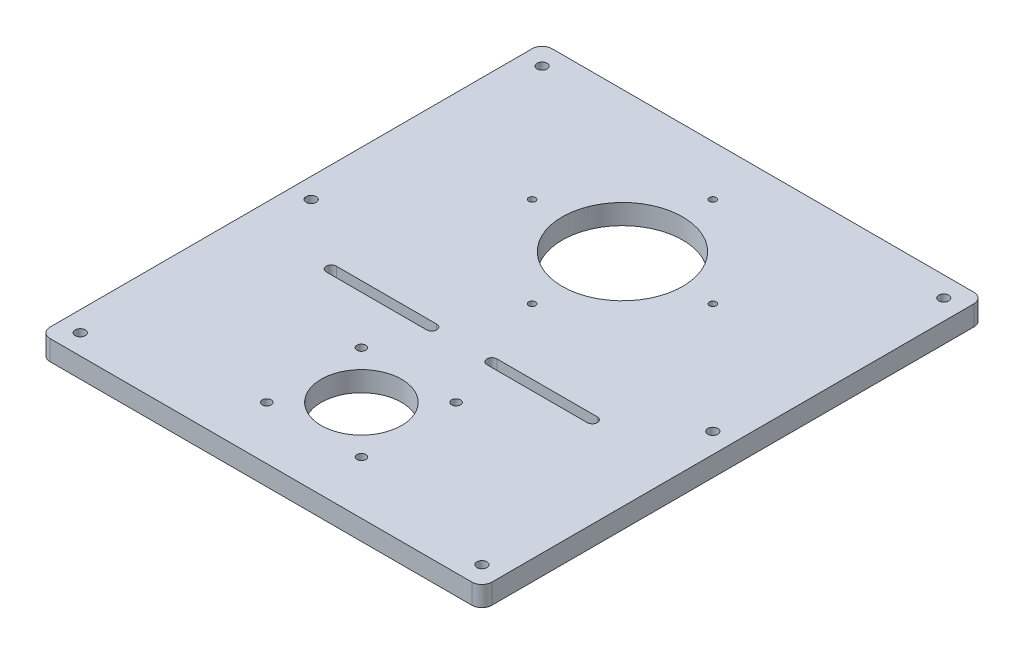
ISO-10303-21;
HEADER;
FILE_DESCRIPTION(('STEP AP214'),'2;1');
FILE_NAME('part.step','',(''),(''),'','','');
FILE_SCHEMA(('AUTOMOTIVE_DESIGN { 1 0 10303 214 1 1 1 1 }'));
ENDSEC;
DATA;
#1=APPLICATION_CONTEXT('core data for automotive mechanical design processes');
#2=APPLICATION_PROTOCOL_DEFINITION('international standard','automotive_design',2000,#1);
#3=PRODUCT_CONTEXT('',#1,'mechanical');
#4=PRODUCT('Part','Part','',(#3));
#5=PRODUCT_RELATED_PRODUCT_CATEGORY('part','',(#4));
#6=PRODUCT_DEFINITION_FORMATION('','',#4);
#7=PRODUCT_DEFINITION_CONTEXT('part definition',#1,'design');
#8=PRODUCT_DEFINITION('design','',#6,#7);
#9=PRODUCT_DEFINITION_SHAPE('','',#8);
#10=(LENGTH_UNIT() NAMED_UNIT(*) SI_UNIT(.MILLI.,.METRE.));
#11=(NAMED_UNIT(*) PLANE_ANGLE_UNIT() SI_UNIT($,.RADIAN.));
#12=(NAMED_UNIT(*) SI_UNIT($,.STERADIAN.) SOLID_ANGLE_UNIT());
#13=UNCERTAINTY_MEASURE_WITH_UNIT(LENGTH_MEASURE(1.E-05),#10,'distance_accuracy_value','');
#14=(GEOMETRIC_REPRESENTATION_CONTEXT(3) GLOBAL_UNCERTAINTY_ASSIGNED_CONTEXT((#13)) GLOBAL_UNIT_ASSIGNED_CONTEXT((#10,
#11,#12)) REPRESENTATION_CONTEXT('',''));
#15=CARTESIAN_POINT('',(0.,0.,0.));
#16=DIRECTION('',(0.,0.,1.));
#17=DIRECTION('',(1.,0.,0.));
#18=AXIS2_PLACEMENT_3D('',#15,#16,#17);
#19=CARTESIAN_POINT('',(0.,10.,0.));
#20=DIRECTION('',(0.,1.,0.));
#21=DIRECTION('',(0.,0.,1.));
#22=AXIS2_PLACEMENT_3D('',#19,#20,#21);
#23=PLANE('',#22);
#24=CARTESIAN_POINT('',(45.,10.,-1.57116660247941E-13));
#25=DIRECTION('',(0.,1.,0.));
#26=DIRECTION('',(0.,0.,1.));
#27=AXIS2_PLACEMENT_3D('',#24,#25,#26);
#28=CIRCLE('',#27,1.7);
#29=CARTESIAN_POINT('',(45.,10.,1.69999999999984));
#30=VERTEX_POINT('',#29);
#31=EDGE_CURVE('E781',#30,#30,#28,.T.);
#32=ORIENTED_EDGE('',*,*,#31,.F.);
#33=EDGE_LOOP('',(#32));
#34=FACE_BOUND('',#33,.T.);
#35=CARTESIAN_POINT('',(0.,10.,-45.));
#36=DIRECTION('',(0.,1.,0.));
#37=DIRECTION('',(0.,0.,1.));
#38=AXIS2_PLACEMENT_3D('',#35,#36,#37);
#39=CIRCLE('',#38,1.7);
#40=CARTESIAN_POINT('',(0.,10.,-43.3));
#41=VERTEX_POINT('',#40);
#42=EDGE_CURVE('E783',#41,#41,#39,.T.);
#43=ORIENTED_EDGE('',*,*,#42,.F.);
#44=EDGE_LOOP('',(#43));
#45=FACE_BOUND('',#44,.T.);
#46=CARTESIAN_POINT('',(-45.,10.,4.71349980743823E-13));
#47=DIRECTION('',(0.,1.,0.));
#48=DIRECTION('',(0.,0.,1.));
#49=AXIS2_PLACEMENT_3D('',#46,#47,#48);
#50=CIRCLE('',#49,1.7);
#51=CARTESIAN_POINT('',(-45.,10.,1.70000000000047));
#52=VERTEX_POINT('',#51);
#53=EDGE_CURVE('E786',#52,#52,#50,.T.);
#54=ORIENTED_EDGE('',*,*,#53,.F.);
#55=EDGE_LOOP('',(#54));
#56=FACE_BOUND('',#55,.T.);
#57=CARTESIAN_POINT('',(0.,10.,45.));
#58=DIRECTION('',(0.,1.,0.));
#59=DIRECTION('',(0.,0.,1.));
#60=AXIS2_PLACEMENT_3D('',#57,#58,#59);
#61=CIRCLE('',#60,1.7);
#62=CARTESIAN_POINT('',(0.,10.,46.7));
#63=VERTEX_POINT('',#62);
#64=EDGE_CURVE('E758',#63,#63,#61,.T.);
#65=ORIENTED_EDGE('',*,*,#64,.F.);
#66=EDGE_LOOP('',(#65));
#67=FACE_BOUND('',#66,.T.);
#68=CARTESIAN_POINT('',(-100.,10.,55.));
#69=DIRECTION('',(0.,1.,0.));
#70=DIRECTION('',(0.,0.,1.));
#71=AXIS2_PLACEMENT_3D('',#68,#69,#70);
#72=CIRCLE('',#71,2.50000000000001);
#73=CARTESIAN_POINT('',(-100.,10.,57.5));
#74=VERTEX_POINT('',#73);
#75=EDGE_CURVE('E188',#74,#74,#72,.T.);
#76=ORIENTED_EDGE('',*,*,#75,.F.);
#77=EDGE_LOOP('',(#76));
#78=FACE_BOUND('',#77,.T.);
#79=CARTESIAN_POINT('',(100.,10.,170.));
#80=DIRECTION('',(0.,1.,0.));
#81=DIRECTION('',(0.,0.,1.));
#82=AXIS2_PLACEMENT_3D('',#79,#80,#81);
#83=CIRCLE('',#82,2.50000000000001);
#84=CARTESIAN_POINT('',(100.,10.,172.5));
#85=VERTEX_POINT('',#84);
#86=EDGE_CURVE('E737',#85,#85,#83,.T.);
#87=ORIENTED_EDGE('',*,*,#86,.F.);
#88=EDGE_LOOP('',(#87));
#89=FACE_BOUND('',#88,.T.);
#90=CARTESIAN_POINT('',(-100.,10.,170.));
#91=DIRECTION('',(0.,1.,0.));
#92=DIRECTION('',(0.,0.,1.));
#93=AXIS2_PLACEMENT_3D('',#90,#91,#92);
#94=CIRCLE('',#93,2.50000000000001);
#95=CARTESIAN_POINT('',(-100.,10.,172.5));
#96=VERTEX_POINT('',#95);
#97=EDGE_CURVE('E734',#96,#96,#94,.T.);
#98=ORIENTED_EDGE('',*,*,#97,.F.);
#99=EDGE_LOOP('',(#98));
#100=FACE_BOUND('',#99,.T.);
#101=CARTESIAN_POINT('',(100.,10.,-60.));
#102=DIRECTION('',(0.,1.,0.));
#103=DIRECTION('',(0.,0.,1.));
#104=AXIS2_PLACEMENT_3D('',#101,#102,#103);
#105=CIRCLE('',#104,2.50000000000001);
#106=CARTESIAN_POINT('',(100.,10.,-57.5));
#107=VERTEX_POINT('',#106);
#108=EDGE_CURVE('E731',#107,#107,#105,.T.);
#109=ORIENTED_EDGE('',*,*,#108,.F.);
#110=EDGE_LOOP('',(#109));
#111=FACE_BOUND('',#110,.T.);
#112=CARTESIAN_POINT('',(100.,10.,55.));
#113=DIRECTION('',(0.,1.,0.));
#114=DIRECTION('',(0.,0.,1.));
#115=AXIS2_PLACEMENT_3D('',#112,#113,#114);
#116=CIRCLE('',#115,2.5);
#117=CARTESIAN_POINT('',(100.,10.,57.5));
#118=VERTEX_POINT('',#117);
#119=EDGE_CURVE('E722',#118,#118,#116,.T.);
#120=ORIENTED_EDGE('',*,*,#119,.F.);
#121=EDGE_LOOP('',(#120));
#122=FACE_BOUND('',#121,.T.);
#123=CARTESIAN_POINT('',(-100.,10.,-60.));
#124=DIRECTION('',(0.,1.,0.));
#125=DIRECTION('',(0.,0.,1.));
#126=AXIS2_PLACEMENT_3D('',#123,#124,#125);
#127=CIRCLE('',#126,2.50000000000001);
#128=CARTESIAN_POINT('',(-100.,10.,-57.5));
#129=VERTEX_POINT('',#128);
#130=EDGE_CURVE('E715',#129,#129,#127,.T.);
#131=ORIENTED_EDGE('',*,*,#130,.F.);
#132=EDGE_LOOP('',(#131));
#133=FACE_BOUND('',#132,.T.);
#134=CARTESIAN_POINT('',(-23.57,10.,153.57));
#135=DIRECTION('',(0.,1.,0.));
#136=DIRECTION('',(0.,0.,1.));
#137=AXIS2_PLACEMENT_3D('',#134,#135,#136);
#138=CIRCLE('',#137,2.2);
#139=CARTESIAN_POINT('',(-23.57,10.,155.77));
#140=VERTEX_POINT('',#139);
#141=EDGE_CURVE('E236',#140,#140,#138,.T.);
#142=ORIENTED_EDGE('',*,*,#141,.F.);
#143=EDGE_LOOP('',(#142));
#144=FACE_BOUND('',#143,.T.);
#145=CARTESIAN_POINT('',(-23.57,10.,106.43));
#146=DIRECTION('',(0.,1.,0.));
#147=DIRECTION('',(0.,0.,1.));
#148=AXIS2_PLACEMENT_3D('',#145,#146,#147);
#149=CIRCLE('',#148,2.2);
#150=CARTESIAN_POINT('',(-23.57,10.,108.63));
#151=VERTEX_POINT('',#150);
#152=EDGE_CURVE('E248',#151,#151,#149,.T.);
#153=ORIENTED_EDGE('',*,*,#152,.F.);
#154=EDGE_LOOP('',(#153));
#155=FACE_BOUND('',#154,.T.);
#156=CARTESIAN_POINT('',(0.,10.,0.));
#157=DIRECTION('',(0.,1.,0.));
#158=DIRECTION('',(0.,0.,1.));
#159=AXIS2_PLACEMENT_3D('',#156,#157,#158);
#160=CIRCLE('',#159,30.);
#161=CARTESIAN_POINT('',(0.,10.,30.));
#162=VERTEX_POINT('',#161);
#163=EDGE_CURVE('E260',#162,#162,#160,.T.);
#164=ORIENTED_EDGE('',*,*,#163,.F.);
#165=EDGE_LOOP('',(#164));
#166=FACE_BOUND('',#165,.T.);
#167=DIRECTION('',(1.,0.,0.));
#168=VECTOR('',#167,1.);
#169=CARTESIAN_POINT('',(-110.,10.,180.));
#170=LINE('',#169,#168);
#171=CARTESIAN_POINT('',(-105.,10.,180.));
#172=VERTEX_POINT('',#171);
#173=CARTESIAN_POINT('',(105.,10.,180.));
#174=VERTEX_POINT('',#173);
#175=EDGE_CURVE('E269',#172,#174,#170,.T.);
#176=ORIENTED_EDGE('',*,*,#175,.T.);
#177=CARTESIAN_POINT('',(105.,10.,175.));
#178=DIRECTION('',(0.,1.,0.));
#179=DIRECTION('',(0.,0.,1.));
#180=AXIS2_PLACEMENT_3D('',#177,#178,#179);
#181=CIRCLE('',#180,5.);
#182=CARTESIAN_POINT('',(110.,10.,175.));
#183=VERTEX_POINT('',#182);
#184=EDGE_CURVE('E309',#174,#183,#181,.T.);
#185=ORIENTED_EDGE('',*,*,#184,.T.);
#186=DIRECTION('',(0.,0.,-1.));
#187=VECTOR('',#186,1.);
#188=CARTESIAN_POINT('',(110.,10.,-70.));
#189=LINE('',#188,#187);
#190=CARTESIAN_POINT('',(110.,10.,-65.));
#191=VERTEX_POINT('',#190);
#192=EDGE_CURVE('E273',#183,#191,#189,.T.);
#193=ORIENTED_EDGE('',*,*,#192,.T.);
#194=CARTESIAN_POINT('',(105.,10.,-65.));
#195=DIRECTION('',(0.,1.,0.));
#196=DIRECTION('',(0.,0.,1.));
#197=AXIS2_PLACEMENT_3D('',#194,#195,#196);
#198=CIRCLE('',#197,5.);
#199=CARTESIAN_POINT('',(105.,10.,-70.));
#200=VERTEX_POINT('',#199);
#201=EDGE_CURVE('E63',#191,#200,#198,.T.);
#202=ORIENTED_EDGE('',*,*,#201,.T.);
#203=DIRECTION('',(-1.,0.,0.));
#204=VECTOR('',#203,1.);
#205=CARTESIAN_POINT('',(-110.,10.,-70.));
#206=LINE('',#205,#204);
#207=CARTESIAN_POINT('',(-105.,10.,-70.));
#208=VERTEX_POINT('',#207);
#209=EDGE_CURVE('E275',#200,#208,#206,.T.);
#210=ORIENTED_EDGE('',*,*,#209,.T.);
#211=CARTESIAN_POINT('',(-105.,10.,-65.));
#212=DIRECTION('',(0.,1.,0.));
#213=DIRECTION('',(0.,0.,1.));
#214=AXIS2_PLACEMENT_3D('',#211,#212,#213);
#215=CIRCLE('',#214,5.);
#216=CARTESIAN_POINT('',(-110.,10.,-65.));
#217=VERTEX_POINT('',#216);
#218=EDGE_CURVE('E304',#208,#217,#215,.T.);
#219=ORIENTED_EDGE('',*,*,#218,.T.);
#220=DIRECTION('',(0.,0.,1.));
#221=VECTOR('',#220,1.);
#222=CARTESIAN_POINT('',(-110.,10.,-70.));
#223=LINE('',#222,#221);
#224=CARTESIAN_POINT('',(-110.,10.,175.));
#225=VERTEX_POINT('',#224);
#226=EDGE_CURVE('E266',#217,#225,#223,.T.);
#227=ORIENTED_EDGE('',*,*,#226,.T.);
#228=CARTESIAN_POINT('',(-105.,10.,175.));
#229=DIRECTION('',(0.,1.,0.));
#230=DIRECTION('',(0.,0.,1.));
#231=AXIS2_PLACEMENT_3D('',#228,#229,#230);
#232=CIRCLE('',#231,5.);
#233=EDGE_CURVE('E306',#225,#172,#232,.T.);
#234=ORIENTED_EDGE('',*,*,#233,.T.);
#235=EDGE_LOOP('',(#176,#185,#193,#202,#210,#219,#227,#234));
#236=FACE_BOUND('',#235,.T.);
#237=CARTESIAN_POINT('',(0.,10.,130.));
#238=DIRECTION('',(0.,1.,0.));
#239=DIRECTION('',(0.,0.,1.));
#240=AXIS2_PLACEMENT_3D('',#237,#238,#239);
#241=CIRCLE('',#240,20.);
#242=CARTESIAN_POINT('',(0.,10.,150.));
#243=VERTEX_POINT('',#242);
#244=EDGE_CURVE('E254',#243,#243,#241,.T.);
#245=ORIENTED_EDGE('',*,*,#244,.F.);
#246=EDGE_LOOP('',(#245));
#247=FACE_BOUND('',#246,.T.);
#248=CARTESIAN_POINT('',(23.57,10.,106.43));
#249=DIRECTION('',(0.,1.,0.));
#250=DIRECTION('',(0.,0.,1.));
#251=AXIS2_PLACEMENT_3D('',#248,#249,#250);
#252=CIRCLE('',#251,2.2);
#253=CARTESIAN_POINT('',(23.57,10.,108.63));
#254=VERTEX_POINT('',#253);
#255=EDGE_CURVE('E242',#254,#254,#252,.T.);
#256=ORIENTED_EDGE('',*,*,#255,.F.);
#257=EDGE_LOOP('',(#256));
#258=FACE_BOUND('',#257,.T.);
#259=CARTESIAN_POINT('',(23.57,10.,153.57));
#260=DIRECTION('',(0.,1.,0.));
#261=DIRECTION('',(0.,0.,1.));
#262=AXIS2_PLACEMENT_3D('',#259,#260,#261);
#263=CIRCLE('',#262,2.2);
#264=CARTESIAN_POINT('',(23.57,10.,155.77));
#265=VERTEX_POINT('',#264);
#266=EDGE_CURVE('E230',#265,#265,#263,.T.);
#267=ORIENTED_EDGE('',*,*,#266,.F.);
#268=EDGE_LOOP('',(#267));
#269=FACE_BOUND('',#268,.T.);
#270=DIRECTION('',(1.,0.,0.));
#271=VECTOR('',#270,1.);
#272=CARTESIAN_POINT('',(-65.,10.,82.5));
#273=LINE('',#272,#271);
#274=CARTESIAN_POINT('',(-65.,10.,82.5));
#275=VERTEX_POINT('',#274);
#276=CARTESIAN_POINT('',(-15.,10.,82.5));
#277=VERTEX_POINT('',#276);
#278=EDGE_CURVE('E201',#275,#277,#273,.T.);
#279=ORIENTED_EDGE('',*,*,#278,.F.);
#280=CARTESIAN_POINT('',(-65.,10.,80.));
#281=DIRECTION('',(0.,1.,0.));
#282=DIRECTION('',(0.,0.,1.));
#283=AXIS2_PLACEMENT_3D('',#280,#281,#282);
#284=CIRCLE('',#283,2.5);
#285=CARTESIAN_POINT('',(-65.,10.,77.5));
#286=VERTEX_POINT('',#285);
#287=EDGE_CURVE('E199',#286,#275,#284,.T.);
#288=ORIENTED_EDGE('',*,*,#287,.F.);
#289=DIRECTION('',(-1.,0.,0.));
#290=VECTOR('',#289,1.);
#291=CARTESIAN_POINT('',(-65.,10.,77.5));
#292=LINE('',#291,#290);
#293=CARTESIAN_POINT('',(-15.,10.,77.5));
#294=VERTEX_POINT('',#293);
#295=EDGE_CURVE('E207',#294,#286,#292,.T.);
#296=ORIENTED_EDGE('',*,*,#295,.F.);
#297=CARTESIAN_POINT('',(-15.,10.,80.));
#298=DIRECTION('',(0.,1.,0.));
#299=DIRECTION('',(0.,0.,1.));
#300=AXIS2_PLACEMENT_3D('',#297,#298,#299);
#301=CIRCLE('',#300,2.50000000000004);
#302=EDGE_CURVE('E204',#277,#294,#301,.T.);
#303=ORIENTED_EDGE('',*,*,#302,.F.);
#304=EDGE_LOOP('',(#279,#288,#296,#303));
#305=FACE_BOUND('',#304,.T.);
#306=DIRECTION('',(-1.,0.,0.));
#307=VECTOR('',#306,1.);
#308=CARTESIAN_POINT('',(65.,10.,77.5));
#309=LINE('',#308,#307);
#310=CARTESIAN_POINT('',(65.,10.,77.5));
#311=VERTEX_POINT('',#310);
#312=CARTESIAN_POINT('',(15.,10.,77.5));
#313=VERTEX_POINT('',#312);
#314=EDGE_CURVE('E166',#311,#313,#309,.T.);
#315=ORIENTED_EDGE('',*,*,#314,.F.);
#316=CARTESIAN_POINT('',(65.,10.,80.));
#317=DIRECTION('',(0.,1.,0.));
#318=DIRECTION('',(0.,0.,-1.));
#319=AXIS2_PLACEMENT_3D('',#316,#317,#318);
#320=CIRCLE('',#319,2.5);
#321=CARTESIAN_POINT('',(65.,10.,82.5));
#322=VERTEX_POINT('',#321);
#323=EDGE_CURVE('E156',#322,#311,#320,.T.);
#324=ORIENTED_EDGE('',*,*,#323,.F.);
#325=DIRECTION('',(1.,0.,0.));
#326=VECTOR('',#325,1.);
#327=CARTESIAN_POINT('',(65.,10.,82.5));
#328=LINE('',#327,#326);
#329=CARTESIAN_POINT('',(15.,10.,82.5));
#330=VERTEX_POINT('',#329);
#331=EDGE_CURVE('E181',#330,#322,#328,.T.);
#332=ORIENTED_EDGE('',*,*,#331,.F.);
#333=CARTESIAN_POINT('',(15.,10.,80.));
#334=DIRECTION('',(0.,1.,0.));
#335=DIRECTION('',(0.,0.,-1.));
#336=AXIS2_PLACEMENT_3D('',#333,#334,#335);
#337=CIRCLE('',#336,2.50000000000004);
#338=EDGE_CURVE('E179',#313,#330,#337,.T.);
#339=ORIENTED_EDGE('',*,*,#338,.F.);
#340=EDGE_LOOP('',(#315,#324,#332,#339));
#341=FACE_BOUND('',#340,.T.);
#342=ADVANCED_FACE('F41',(#34,#45,#56,#67,#78,#89,#100,#111,#122,#133,#144,#155,#166,#236,#247,
#258,#269,#305,#341),#23,.T.);
#343=CARTESIAN_POINT('',(0.,0.,0.));
#344=DIRECTION('',(0.,1.,0.));
#345=DIRECTION('',(0.,0.,1.));
#346=AXIS2_PLACEMENT_3D('',#343,#344,#345);
#347=PLANE('',#346);
#348=CARTESIAN_POINT('',(45.,0.,-1.57116660247941E-13));
#349=DIRECTION('',(0.,1.,0.));
#350=DIRECTION('',(1.,0.,0.));
#351=AXIS2_PLACEMENT_3D('',#348,#349,#350);
#352=CIRCLE('',#351,1.7);
#353=CARTESIAN_POINT('',(46.7,0.,-1.63052178523974E-13));
#354=VERTEX_POINT('',#353);
#355=EDGE_CURVE('E789',#354,#354,#352,.T.);
#356=ORIENTED_EDGE('',*,*,#355,.T.);
#357=EDGE_LOOP('',(#356));
#358=FACE_BOUND('',#357,.T.);
#359=CARTESIAN_POINT('',(0.,0.,-45.));
#360=DIRECTION('',(0.,1.,0.));
#361=DIRECTION('',(0.,0.,-1.));
#362=AXIS2_PLACEMENT_3D('',#359,#360,#361);
#363=CIRCLE('',#362,1.7);
#364=CARTESIAN_POINT('',(0.,0.,-46.7));
#365=VERTEX_POINT('',#364);
#366=EDGE_CURVE('E793',#365,#365,#363,.T.);
#367=ORIENTED_EDGE('',*,*,#366,.T.);
#368=EDGE_LOOP('',(#367));
#369=FACE_BOUND('',#368,.T.);
#370=CARTESIAN_POINT('',(-45.,0.,4.71349980743823E-13));
#371=DIRECTION('',(0.,1.,0.));
#372=DIRECTION('',(-1.,0.,0.));
#373=AXIS2_PLACEMENT_3D('',#370,#371,#372);
#374=CIRCLE('',#373,1.7);
#375=CARTESIAN_POINT('',(-46.7,0.,4.89156535571923E-13));
#376=VERTEX_POINT('',#375);
#377=EDGE_CURVE('E790',#376,#376,#374,.T.);
#378=ORIENTED_EDGE('',*,*,#377,.T.);
#379=EDGE_LOOP('',(#378));
#380=FACE_BOUND('',#379,.T.);
#381=CARTESIAN_POINT('',(0.,0.,45.));
#382=DIRECTION('',(0.,1.,0.));
#383=DIRECTION('',(0.,0.,1.));
#384=AXIS2_PLACEMENT_3D('',#381,#382,#383);
#385=CIRCLE('',#384,1.7);
#386=CARTESIAN_POINT('',(0.,0.,46.7));
#387=VERTEX_POINT('',#386);
#388=EDGE_CURVE('E764',#387,#387,#385,.T.);
#389=ORIENTED_EDGE('',*,*,#388,.T.);
#390=EDGE_LOOP('',(#389));
#391=FACE_BOUND('',#390,.T.);
#392=CARTESIAN_POINT('',(-100.,0.,55.));
#393=DIRECTION('',(0.,1.,0.));
#394=DIRECTION('',(0.,0.,1.));
#395=AXIS2_PLACEMENT_3D('',#392,#393,#394);
#396=CIRCLE('',#395,2.50000000000001);
#397=CARTESIAN_POINT('',(-100.,0.,57.5));
#398=VERTEX_POINT('',#397);
#399=EDGE_CURVE('E757',#398,#398,#396,.T.);
#400=ORIENTED_EDGE('',*,*,#399,.T.);
#401=EDGE_LOOP('',(#400));
#402=FACE_BOUND('',#401,.T.);
#403=CARTESIAN_POINT('',(100.,0.,170.));
#404=DIRECTION('',(0.,1.,0.));
#405=DIRECTION('',(0.,0.,1.));
#406=AXIS2_PLACEMENT_3D('',#403,#404,#405);
#407=CIRCLE('',#406,2.50000000000001);
#408=CARTESIAN_POINT('',(100.,0.,172.5));
#409=VERTEX_POINT('',#408);
#410=EDGE_CURVE('E761',#409,#409,#407,.T.);
#411=ORIENTED_EDGE('',*,*,#410,.T.);
#412=EDGE_LOOP('',(#411));
#413=FACE_BOUND('',#412,.T.);
#414=CARTESIAN_POINT('',(-100.,0.,170.));
#415=DIRECTION('',(0.,1.,0.));
#416=DIRECTION('',(0.,0.,1.));
#417=AXIS2_PLACEMENT_3D('',#414,#415,#416);
#418=CIRCLE('',#417,2.50000000000001);
#419=CARTESIAN_POINT('',(-100.,0.,172.5));
#420=VERTEX_POINT('',#419);
#421=EDGE_CURVE('E725',#420,#420,#418,.T.);
#422=ORIENTED_EDGE('',*,*,#421,.T.);
#423=EDGE_LOOP('',(#422));
#424=FACE_BOUND('',#423,.T.);
#425=CARTESIAN_POINT('',(100.,0.,-60.));
#426=DIRECTION('',(0.,1.,0.));
#427=DIRECTION('',(0.,0.,1.));
#428=AXIS2_PLACEMENT_3D('',#425,#426,#427);
#429=CIRCLE('',#428,2.50000000000001);
#430=CARTESIAN_POINT('',(100.,0.,-57.5));
#431=VERTEX_POINT('',#430);
#432=EDGE_CURVE('E720',#431,#431,#429,.T.);
#433=ORIENTED_EDGE('',*,*,#432,.T.);
#434=EDGE_LOOP('',(#433));
#435=FACE_BOUND('',#434,.T.);
#436=CARTESIAN_POINT('',(100.,0.,55.));
#437=DIRECTION('',(0.,1.,0.));
#438=DIRECTION('',(0.,0.,1.));
#439=AXIS2_PLACEMENT_3D('',#436,#437,#438);
#440=CIRCLE('',#439,2.5);
#441=CARTESIAN_POINT('',(100.,0.,57.5));
#442=VERTEX_POINT('',#441);
#443=EDGE_CURVE('E755',#442,#442,#440,.T.);
#444=ORIENTED_EDGE('',*,*,#443,.T.);
#445=EDGE_LOOP('',(#444));
#446=FACE_BOUND('',#445,.T.);
#447=CARTESIAN_POINT('',(-100.,0.,-60.));
#448=DIRECTION('',(0.,1.,0.));
#449=DIRECTION('',(0.,0.,1.));
#450=AXIS2_PLACEMENT_3D('',#447,#448,#449);
#451=CIRCLE('',#450,2.50000000000001);
#452=CARTESIAN_POINT('',(-100.,0.,-57.5));
#453=VERTEX_POINT('',#452);
#454=EDGE_CURVE('E718',#453,#453,#451,.T.);
#455=ORIENTED_EDGE('',*,*,#454,.T.);
#456=EDGE_LOOP('',(#455));
#457=FACE_BOUND('',#456,.T.);
#458=CARTESIAN_POINT('',(-65.,0.,80.));
#459=DIRECTION('',(0.,1.,0.));
#460=DIRECTION('',(0.,0.,1.));
#461=AXIS2_PLACEMENT_3D('',#458,#459,#460);
#462=CIRCLE('',#461,2.5);
#463=CARTESIAN_POINT('',(-65.,0.,77.5));
#464=VERTEX_POINT('',#463);
#465=CARTESIAN_POINT('',(-65.,0.,82.5));
#466=VERTEX_POINT('',#465);
#467=EDGE_CURVE('E174',#464,#466,#462,.T.);
#468=ORIENTED_EDGE('',*,*,#467,.T.);
#469=DIRECTION('',(1.,0.,0.));
#470=VECTOR('',#469,1.);
#471=CARTESIAN_POINT('',(-65.,0.,82.5));
#472=LINE('',#471,#470);
#473=CARTESIAN_POINT('',(-15.,0.,82.5));
#474=VERTEX_POINT('',#473);
#475=EDGE_CURVE('E212',#466,#474,#472,.T.);
#476=ORIENTED_EDGE('',*,*,#475,.T.);
#477=CARTESIAN_POINT('',(-15.,0.,80.));
#478=DIRECTION('',(0.,1.,0.));
#479=DIRECTION('',(0.,0.,1.));
#480=AXIS2_PLACEMENT_3D('',#477,#478,#479);
#481=CIRCLE('',#480,2.50000000000004);
#482=CARTESIAN_POINT('',(-15.,0.,77.5));
#483=VERTEX_POINT('',#482);
#484=EDGE_CURVE('E215',#474,#483,#481,.T.);
#485=ORIENTED_EDGE('',*,*,#484,.T.);
#486=DIRECTION('',(-1.,0.,0.));
#487=VECTOR('',#486,1.);
#488=CARTESIAN_POINT('',(-65.,0.,77.5));
#489=LINE('',#488,#487);
#490=EDGE_CURVE('E202',#483,#464,#489,.T.);
#491=ORIENTED_EDGE('',*,*,#490,.T.);
#492=EDGE_LOOP('',(#468,#476,#485,#491));
#493=FACE_BOUND('',#492,.T.);
#494=DIRECTION('',(0.,0.,-1.));
#495=VECTOR('',#494,1.);
#496=CARTESIAN_POINT('',(110.,0.,-70.));
#497=LINE('',#496,#495);
#498=CARTESIAN_POINT('',(110.,0.,175.));
#499=VERTEX_POINT('',#498);
#500=CARTESIAN_POINT('',(110.,0.,-65.));
#501=VERTEX_POINT('',#500);
#502=EDGE_CURVE('E283',#499,#501,#497,.T.);
#503=ORIENTED_EDGE('',*,*,#502,.F.);
#504=CARTESIAN_POINT('',(105.,0.,175.));
#505=DIRECTION('',(0.,1.,0.));
#506=DIRECTION('',(0.,0.,1.));
#507=AXIS2_PLACEMENT_3D('',#504,#505,#506);
#508=CIRCLE('',#507,5.);
#509=CARTESIAN_POINT('',(105.,0.,180.));
#510=VERTEX_POINT('',#509);
#511=EDGE_CURVE('E297',#499,#510,#508,.F.);
#512=ORIENTED_EDGE('',*,*,#511,.T.);
#513=DIRECTION('',(1.,0.,0.));
#514=VECTOR('',#513,1.);
#515=CARTESIAN_POINT('',(-110.,0.,180.));
#516=LINE('',#515,#514);
#517=CARTESIAN_POINT('',(-105.,0.,180.));
#518=VERTEX_POINT('',#517);
#519=EDGE_CURVE('E280',#518,#510,#516,.T.);
#520=ORIENTED_EDGE('',*,*,#519,.F.);
#521=CARTESIAN_POINT('',(-105.,0.,175.));
#522=DIRECTION('',(0.,1.,0.));
#523=DIRECTION('',(0.,0.,1.));
#524=AXIS2_PLACEMENT_3D('',#521,#522,#523);
#525=CIRCLE('',#524,5.);
#526=CARTESIAN_POINT('',(-110.,0.,175.));
#527=VERTEX_POINT('',#526);
#528=EDGE_CURVE('E293',#518,#527,#525,.F.);
#529=ORIENTED_EDGE('',*,*,#528,.T.);
#530=DIRECTION('',(0.,0.,1.));
#531=VECTOR('',#530,1.);
#532=CARTESIAN_POINT('',(-110.,0.,-70.));
#533=LINE('',#532,#531);
#534=CARTESIAN_POINT('',(-110.,0.,-65.));
#535=VERTEX_POINT('',#534);
#536=EDGE_CURVE('E263',#535,#527,#533,.T.);
#537=ORIENTED_EDGE('',*,*,#536,.F.);
#538=CARTESIAN_POINT('',(-105.,0.,-65.));
#539=DIRECTION('',(0.,1.,0.));
#540=DIRECTION('',(0.,0.,1.));
#541=AXIS2_PLACEMENT_3D('',#538,#539,#540);
#542=CIRCLE('',#541,5.);
#543=CARTESIAN_POINT('',(-105.,0.,-70.));
#544=VERTEX_POINT('',#543);
#545=EDGE_CURVE('E291',#535,#544,#542,.F.);
#546=ORIENTED_EDGE('',*,*,#545,.T.);
#547=DIRECTION('',(-1.,0.,0.));
#548=VECTOR('',#547,1.);
#549=CARTESIAN_POINT('',(-110.,0.,-70.));
#550=LINE('',#549,#548);
#551=CARTESIAN_POINT('',(105.,0.,-70.));
#552=VERTEX_POINT('',#551);
#553=EDGE_CURVE('E270',#552,#544,#550,.T.);
#554=ORIENTED_EDGE('',*,*,#553,.F.);
#555=CARTESIAN_POINT('',(105.,0.,-65.));
#556=DIRECTION('',(0.,1.,0.));
#557=DIRECTION('',(0.,0.,1.));
#558=AXIS2_PLACEMENT_3D('',#555,#556,#557);
#559=CIRCLE('',#558,5.);
#560=EDGE_CURVE('E295',#552,#501,#559,.F.);
#561=ORIENTED_EDGE('',*,*,#560,.T.);
#562=EDGE_LOOP('',(#503,#512,#520,#529,#537,#546,#554,#561));
#563=FACE_BOUND('',#562,.T.);
#564=CARTESIAN_POINT('',(0.,0.,0.));
#565=DIRECTION('',(0.,1.,0.));
#566=DIRECTION('',(0.,0.,1.));
#567=AXIS2_PLACEMENT_3D('',#564,#565,#566);
#568=CIRCLE('',#567,30.);
#569=CARTESIAN_POINT('',(0.,0.,30.));
#570=VERTEX_POINT('',#569);
#571=EDGE_CURVE('E257',#570,#570,#568,.T.);
#572=ORIENTED_EDGE('',*,*,#571,.T.);
#573=EDGE_LOOP('',(#572));
#574=FACE_BOUND('',#573,.T.);
#575=CARTESIAN_POINT('',(0.,0.,130.));
#576=DIRECTION('',(0.,1.,0.));
#577=DIRECTION('',(0.,0.,1.));
#578=AXIS2_PLACEMENT_3D('',#575,#576,#577);
#579=CIRCLE('',#578,20.);
#580=CARTESIAN_POINT('',(0.,0.,150.));
#581=VERTEX_POINT('',#580);
#582=EDGE_CURVE('E251',#581,#581,#579,.T.);
#583=ORIENTED_EDGE('',*,*,#582,.T.);
#584=EDGE_LOOP('',(#583));
#585=FACE_BOUND('',#584,.T.);
#586=CARTESIAN_POINT('',(-23.57,0.,106.43));
#587=DIRECTION('',(0.,1.,0.));
#588=DIRECTION('',(0.,0.,1.));
#589=AXIS2_PLACEMENT_3D('',#586,#587,#588);
#590=CIRCLE('',#589,2.2);
#591=CARTESIAN_POINT('',(-23.57,0.,108.63));
#592=VERTEX_POINT('',#591);
#593=EDGE_CURVE('E245',#592,#592,#590,.T.);
#594=ORIENTED_EDGE('',*,*,#593,.T.);
#595=EDGE_LOOP('',(#594));
#596=FACE_BOUND('',#595,.T.);
#597=CARTESIAN_POINT('',(23.57,0.,106.43));
#598=DIRECTION('',(0.,1.,0.));
#599=DIRECTION('',(0.,0.,1.));
#600=AXIS2_PLACEMENT_3D('',#597,#598,#599);
#601=CIRCLE('',#600,2.2);
#602=CARTESIAN_POINT('',(23.57,0.,108.63));
#603=VERTEX_POINT('',#602);
#604=EDGE_CURVE('E239',#603,#603,#601,.T.);
#605=ORIENTED_EDGE('',*,*,#604,.T.);
#606=EDGE_LOOP('',(#605));
#607=FACE_BOUND('',#606,.T.);
#608=CARTESIAN_POINT('',(-23.57,0.,153.57));
#609=DIRECTION('',(0.,1.,0.));
#610=DIRECTION('',(0.,0.,1.));
#611=AXIS2_PLACEMENT_3D('',#608,#609,#610);
#612=CIRCLE('',#611,2.2);
#613=CARTESIAN_POINT('',(-23.57,0.,155.77));
#614=VERTEX_POINT('',#613);
#615=EDGE_CURVE('E233',#614,#614,#612,.T.);
#616=ORIENTED_EDGE('',*,*,#615,.T.);
#617=EDGE_LOOP('',(#616));
#618=FACE_BOUND('',#617,.T.);
#619=CARTESIAN_POINT('',(23.57,0.,153.57));
#620=DIRECTION('',(0.,1.,0.));
#621=DIRECTION('',(0.,0.,1.));
#622=AXIS2_PLACEMENT_3D('',#619,#620,#621);
#623=CIRCLE('',#622,2.2);
#624=CARTESIAN_POINT('',(23.57,0.,155.77));
#625=VERTEX_POINT('',#624);
#626=EDGE_CURVE('E229',#625,#625,#623,.T.);
#627=ORIENTED_EDGE('',*,*,#626,.T.);
#628=EDGE_LOOP('',(#627));
#629=FACE_BOUND('',#628,.T.);
#630=CARTESIAN_POINT('',(65.,0.,80.));
#631=DIRECTION('',(0.,1.,0.));
#632=DIRECTION('',(0.,0.,-1.));
#633=AXIS2_PLACEMENT_3D('',#630,#631,#632);
#634=CIRCLE('',#633,2.5);
#635=CARTESIAN_POINT('',(65.,0.,82.5));
#636=VERTEX_POINT('',#635);
#637=CARTESIAN_POINT('',(65.,0.,77.5));
#638=VERTEX_POINT('',#637);
#639=EDGE_CURVE('E186',#636,#638,#634,.T.);
#640=ORIENTED_EDGE('',*,*,#639,.T.);
#641=DIRECTION('',(-1.,0.,0.));
#642=VECTOR('',#641,1.);
#643=CARTESIAN_POINT('',(65.,0.,77.5));
#644=LINE('',#643,#642);
#645=CARTESIAN_POINT('',(15.,0.,77.5));
#646=VERTEX_POINT('',#645);
#647=EDGE_CURVE('E173',#638,#646,#644,.T.);
#648=ORIENTED_EDGE('',*,*,#647,.T.);
#649=CARTESIAN_POINT('',(15.,0.,80.));
#650=DIRECTION('',(0.,1.,0.));
#651=DIRECTION('',(0.,0.,-1.));
#652=AXIS2_PLACEMENT_3D('',#649,#650,#651);
#653=CIRCLE('',#652,2.50000000000004);
#654=CARTESIAN_POINT('',(15.,0.,82.5));
#655=VERTEX_POINT('',#654);
#656=EDGE_CURVE('E190',#646,#655,#653,.T.);
#657=ORIENTED_EDGE('',*,*,#656,.T.);
#658=DIRECTION('',(1.,0.,0.));
#659=VECTOR('',#658,1.);
#660=CARTESIAN_POINT('',(65.,0.,82.5));
#661=LINE('',#660,#659);
#662=EDGE_CURVE('E167',#655,#636,#661,.T.);
#663=ORIENTED_EDGE('',*,*,#662,.T.);
#664=EDGE_LOOP('',(#640,#648,#657,#663));
#665=FACE_BOUND('',#664,.T.);
#666=ADVANCED_FACE('F325',(#358,#369,#380,#391,#402,#413,#424,#435,#446,#457,#493,#563,#574,
#585,#596,#607,#618,#629,#665),#347,.F.);
#667=CARTESIAN_POINT('',(-110.,10.,-70.));
#668=DIRECTION('',(1.,0.,0.));
#669=DIRECTION('',(0.,0.,-1.));
#670=AXIS2_PLACEMENT_3D('',#667,#668,#669);
#671=PLANE('',#670);
#672=ORIENTED_EDGE('',*,*,#536,.T.);
#673=DIRECTION('',(0.,-1.,0.));
#674=VECTOR('',#673,1.);
#675=CARTESIAN_POINT('',(-110.,10.,175.));
#676=LINE('',#675,#674);
#677=EDGE_CURVE('E11',#527,#225,#676,.F.);
#678=ORIENTED_EDGE('',*,*,#677,.T.);
#679=ORIENTED_EDGE('',*,*,#226,.F.);
#680=DIRECTION('',(0.,-1.,0.));
#681=VECTOR('',#680,1.);
#682=CARTESIAN_POINT('',(-110.,10.,-65.));
#683=LINE('',#682,#681);
#684=EDGE_CURVE('E49',#217,#535,#683,.T.);
#685=ORIENTED_EDGE('',*,*,#684,.T.);
#686=EDGE_LOOP('',(#672,#678,#679,#685));
#687=FACE_BOUND('',#686,.T.);
#688=ADVANCED_FACE('F319',(#687),#671,.F.);
#689=CARTESIAN_POINT('',(-110.,10.,180.));
#690=DIRECTION('',(0.,0.,-1.));
#691=DIRECTION('',(-1.,0.,0.));
#692=AXIS2_PLACEMENT_3D('',#689,#690,#691);
#693=PLANE('',#692);
#694=ORIENTED_EDGE('',*,*,#519,.T.);
#695=DIRECTION('',(0.,-1.,0.));
#696=VECTOR('',#695,1.);
#697=CARTESIAN_POINT('',(105.,10.,180.));
#698=LINE('',#697,#696);
#699=EDGE_CURVE('E302',#510,#174,#698,.F.);
#700=ORIENTED_EDGE('',*,*,#699,.T.);
#701=ORIENTED_EDGE('',*,*,#175,.F.);
#702=DIRECTION('',(0.,-1.,0.));
#703=VECTOR('',#702,1.);
#704=CARTESIAN_POINT('',(-105.,10.,180.));
#705=LINE('',#704,#703);
#706=EDGE_CURVE('E299',#172,#518,#705,.T.);
#707=ORIENTED_EDGE('',*,*,#706,.T.);
#708=EDGE_LOOP('',(#694,#700,#701,#707));
#709=FACE_BOUND('',#708,.T.);
#710=ADVANCED_FACE('F335',(#709),#693,.F.);
#711=CARTESIAN_POINT('',(110.,10.,-70.));
#712=DIRECTION('',(-1.,0.,0.));
#713=DIRECTION('',(0.,0.,1.));
#714=AXIS2_PLACEMENT_3D('',#711,#712,#713);
#715=PLANE('',#714);
#716=ORIENTED_EDGE('',*,*,#192,.F.);
#717=DIRECTION('',(0.,-1.,0.));
#718=VECTOR('',#717,1.);
#719=CARTESIAN_POINT('',(110.,10.,175.));
#720=LINE('',#719,#718);
#721=EDGE_CURVE('E288',#183,#499,#720,.T.);
#722=ORIENTED_EDGE('',*,*,#721,.T.);
#723=ORIENTED_EDGE('',*,*,#502,.T.);
#724=DIRECTION('',(0.,-1.,0.));
#725=VECTOR('',#724,1.);
#726=CARTESIAN_POINT('',(110.,10.,-65.));
#727=LINE('',#726,#725);
#728=EDGE_CURVE('E277',#501,#191,#727,.F.);
#729=ORIENTED_EDGE('',*,*,#728,.T.);
#730=EDGE_LOOP('',(#716,#722,#723,#729));
#731=FACE_BOUND('',#730,.T.);
#732=ADVANCED_FACE('F344',(#731),#715,.F.);
#733=CARTESIAN_POINT('',(-110.,10.,-70.));
#734=DIRECTION('',(0.,0.,1.));
#735=DIRECTION('',(1.,0.,0.));
#736=AXIS2_PLACEMENT_3D('',#733,#734,#735);
#737=PLANE('',#736);
#738=ORIENTED_EDGE('',*,*,#209,.F.);
#739=DIRECTION('',(0.,-1.,0.));
#740=VECTOR('',#739,1.);
#741=CARTESIAN_POINT('',(105.,10.,-70.));
#742=LINE('',#741,#740);
#743=EDGE_CURVE('E312',#200,#552,#742,.T.);
#744=ORIENTED_EDGE('',*,*,#743,.T.);
#745=ORIENTED_EDGE('',*,*,#553,.T.);
#746=DIRECTION('',(0.,-1.,0.));
#747=VECTOR('',#746,1.);
#748=CARTESIAN_POINT('',(-105.,10.,-70.));
#749=LINE('',#748,#747);
#750=EDGE_CURVE('E56',#544,#208,#749,.F.);
#751=ORIENTED_EDGE('',*,*,#750,.T.);
#752=EDGE_LOOP('',(#738,#744,#745,#751));
#753=FACE_BOUND('',#752,.T.);
#754=ADVANCED_FACE('F349',(#753),#737,.F.);
#755=CARTESIAN_POINT('',(0.,10.,0.));
#756=DIRECTION('',(0.,-1.,0.));
#757=DIRECTION('',(0.,0.,-1.));
#758=AXIS2_PLACEMENT_3D('',#755,#756,#757);
#759=CYLINDRICAL_SURFACE('',#758,30.);
#760=ORIENTED_EDGE('',*,*,#163,.T.);
#761=EDGE_LOOP('',(#760));
#762=FACE_BOUND('',#761,.T.);
#763=ORIENTED_EDGE('',*,*,#571,.F.);
#764=EDGE_LOOP('',(#763));
#765=FACE_BOUND('',#764,.T.);
#766=ADVANCED_FACE('F370',(#762,#765),#759,.F.);
#767=CARTESIAN_POINT('',(0.,10.,130.));
#768=DIRECTION('',(0.,-1.,0.));
#769=DIRECTION('',(0.,0.,-1.));
#770=AXIS2_PLACEMENT_3D('',#767,#768,#769);
#771=CYLINDRICAL_SURFACE('',#770,20.);
#772=ORIENTED_EDGE('',*,*,#244,.T.);
#773=EDGE_LOOP('',(#772));
#774=FACE_BOUND('',#773,.T.);
#775=ORIENTED_EDGE('',*,*,#582,.F.);
#776=EDGE_LOOP('',(#775));
#777=FACE_BOUND('',#776,.T.);
#778=ADVANCED_FACE('F505',(#774,#777),#771,.F.);
#779=CARTESIAN_POINT('',(-23.57,10.,106.43));
#780=DIRECTION('',(0.,-1.,0.));
#781=DIRECTION('',(0.,0.,-1.));
#782=AXIS2_PLACEMENT_3D('',#779,#780,#781);
#783=CYLINDRICAL_SURFACE('',#782,2.2);
#784=ORIENTED_EDGE('',*,*,#152,.T.);
#785=EDGE_LOOP('',(#784));
#786=FACE_BOUND('',#785,.T.);
#787=ORIENTED_EDGE('',*,*,#593,.F.);
#788=EDGE_LOOP('',(#787));
#789=FACE_BOUND('',#788,.T.);
#790=ADVANCED_FACE('F502',(#786,#789),#783,.F.);
#791=CARTESIAN_POINT('',(23.57,10.,106.43));
#792=DIRECTION('',(0.,-1.,0.));
#793=DIRECTION('',(0.,0.,-1.));
#794=AXIS2_PLACEMENT_3D('',#791,#792,#793);
#795=CYLINDRICAL_SURFACE('',#794,2.2);
#796=ORIENTED_EDGE('',*,*,#255,.T.);
#797=EDGE_LOOP('',(#796));
#798=FACE_BOUND('',#797,.T.);
#799=ORIENTED_EDGE('',*,*,#604,.F.);
#800=EDGE_LOOP('',(#799));
#801=FACE_BOUND('',#800,.T.);
#802=ADVANCED_FACE('F498',(#798,#801),#795,.F.);
#803=CARTESIAN_POINT('',(-23.57,10.,153.57));
#804=DIRECTION('',(0.,-1.,0.));
#805=DIRECTION('',(0.,0.,-1.));
#806=AXIS2_PLACEMENT_3D('',#803,#804,#805);
#807=CYLINDRICAL_SURFACE('',#806,2.2);
#808=ORIENTED_EDGE('',*,*,#141,.T.);
#809=EDGE_LOOP('',(#808));
#810=FACE_BOUND('',#809,.T.);
#811=ORIENTED_EDGE('',*,*,#615,.F.);
#812=EDGE_LOOP('',(#811));
#813=FACE_BOUND('',#812,.T.);
#814=ADVANCED_FACE('F494',(#810,#813),#807,.F.);
#815=CARTESIAN_POINT('',(23.57,10.,153.57));
#816=DIRECTION('',(0.,-1.,0.));
#817=DIRECTION('',(0.,0.,-1.));
#818=AXIS2_PLACEMENT_3D('',#815,#816,#817);
#819=CYLINDRICAL_SURFACE('',#818,2.2);
#820=ORIENTED_EDGE('',*,*,#266,.T.);
#821=EDGE_LOOP('',(#820));
#822=FACE_BOUND('',#821,.T.);
#823=ORIENTED_EDGE('',*,*,#626,.F.);
#824=EDGE_LOOP('',(#823));
#825=FACE_BOUND('',#824,.T.);
#826=ADVANCED_FACE('F490',(#822,#825),#819,.F.);
#827=CARTESIAN_POINT('',(-65.,10.,80.));
#828=DIRECTION('',(0.,-1.,0.));
#829=DIRECTION('',(0.,0.,-1.));
#830=AXIS2_PLACEMENT_3D('',#827,#828,#829);
#831=CYLINDRICAL_SURFACE('',#830,2.5);
#832=ORIENTED_EDGE('',*,*,#467,.F.);
#833=DIRECTION('',(0.,-1.,0.));
#834=VECTOR('',#833,1.);
#835=CARTESIAN_POINT('',(-65.,10.,77.5));
#836=LINE('',#835,#834);
#837=EDGE_CURVE('E209',#286,#464,#836,.T.);
#838=ORIENTED_EDGE('',*,*,#837,.F.);
#839=ORIENTED_EDGE('',*,*,#287,.T.);
#840=DIRECTION('',(0.,-1.,0.));
#841=VECTOR('',#840,1.);
#842=CARTESIAN_POINT('',(-65.,10.,82.5));
#843=LINE('',#842,#841);
#844=EDGE_CURVE('E226',#275,#466,#843,.T.);
#845=ORIENTED_EDGE('',*,*,#844,.T.);
#846=EDGE_LOOP('',(#832,#838,#839,#845));
#847=FACE_BOUND('',#846,.T.);
#848=ADVANCED_FACE('F486',(#847),#831,.F.);
#849=CARTESIAN_POINT('',(-65.,10.,82.5));
#850=DIRECTION('',(0.,0.,-1.));
#851=DIRECTION('',(-1.,0.,0.));
#852=AXIS2_PLACEMENT_3D('',#849,#850,#851);
#853=PLANE('',#852);
#854=ORIENTED_EDGE('',*,*,#475,.F.);
#855=ORIENTED_EDGE('',*,*,#844,.F.);
#856=ORIENTED_EDGE('',*,*,#278,.T.);
#857=DIRECTION('',(0.,-1.,0.));
#858=VECTOR('',#857,1.);
#859=CARTESIAN_POINT('',(-15.,10.,82.5));
#860=LINE('',#859,#858);
#861=EDGE_CURVE('E224',#277,#474,#860,.T.);
#862=ORIENTED_EDGE('',*,*,#861,.T.);
#863=EDGE_LOOP('',(#854,#855,#856,#862));
#864=FACE_BOUND('',#863,.T.);
#865=ADVANCED_FACE('F482',(#864),#853,.T.);
#866=CARTESIAN_POINT('',(-15.,10.,80.));
#867=DIRECTION('',(0.,-1.,0.));
#868=DIRECTION('',(0.,0.,-1.));
#869=AXIS2_PLACEMENT_3D('',#866,#867,#868);
#870=CYLINDRICAL_SURFACE('',#869,2.50000000000004);
#871=ORIENTED_EDGE('',*,*,#484,.F.);
#872=ORIENTED_EDGE('',*,*,#861,.F.);
#873=ORIENTED_EDGE('',*,*,#302,.T.);
#874=DIRECTION('',(0.,-1.,0.));
#875=VECTOR('',#874,1.);
#876=CARTESIAN_POINT('',(-15.,10.,77.5));
#877=LINE('',#876,#875);
#878=EDGE_CURVE('E222',#294,#483,#877,.T.);
#879=ORIENTED_EDGE('',*,*,#878,.T.);
#880=EDGE_LOOP('',(#871,#872,#873,#879));
#881=FACE_BOUND('',#880,.T.);
#882=ADVANCED_FACE('F478',(#881),#870,.F.);
#883=CARTESIAN_POINT('',(-65.,10.,77.5));
#884=DIRECTION('',(0.,0.,1.));
#885=DIRECTION('',(1.,0.,0.));
#886=AXIS2_PLACEMENT_3D('',#883,#884,#885);
#887=PLANE('',#886);
#888=ORIENTED_EDGE('',*,*,#490,.F.);
#889=ORIENTED_EDGE('',*,*,#878,.F.);
#890=ORIENTED_EDGE('',*,*,#295,.T.);
#891=ORIENTED_EDGE('',*,*,#837,.T.);
#892=EDGE_LOOP('',(#888,#889,#890,#891));
#893=FACE_BOUND('',#892,.T.);
#894=ADVANCED_FACE('F475',(#893),#887,.T.);
#895=CARTESIAN_POINT('',(65.,10.,80.));
#896=DIRECTION('',(0.,-1.,0.));
#897=DIRECTION('',(0.,0.,-1.));
#898=AXIS2_PLACEMENT_3D('',#895,#896,#897);
#899=CYLINDRICAL_SURFACE('',#898,2.5);
#900=ORIENTED_EDGE('',*,*,#639,.F.);
#901=DIRECTION('',(0.,-1.,0.));
#902=VECTOR('',#901,1.);
#903=CARTESIAN_POINT('',(65.,10.,82.5));
#904=LINE('',#903,#902);
#905=EDGE_CURVE('E162',#322,#636,#904,.T.);
#906=ORIENTED_EDGE('',*,*,#905,.F.);
#907=ORIENTED_EDGE('',*,*,#323,.T.);
#908=DIRECTION('',(0.,-1.,0.));
#909=VECTOR('',#908,1.);
#910=CARTESIAN_POINT('',(65.,10.,77.5));
#911=LINE('',#910,#909);
#912=EDGE_CURVE('E159',#311,#638,#911,.T.);
#913=ORIENTED_EDGE('',*,*,#912,.T.);
#914=EDGE_LOOP('',(#900,#906,#907,#913));
#915=FACE_BOUND('',#914,.T.);
#916=ADVANCED_FACE('F158',(#915),#899,.F.);
#917=CARTESIAN_POINT('',(65.,10.,77.5));
#918=DIRECTION('',(0.,0.,1.));
#919=DIRECTION('',(1.,0.,0.));
#920=AXIS2_PLACEMENT_3D('',#917,#918,#919);
#921=PLANE('',#920);
#922=ORIENTED_EDGE('',*,*,#647,.F.);
#923=ORIENTED_EDGE('',*,*,#912,.F.);
#924=ORIENTED_EDGE('',*,*,#314,.T.);
#925=DIRECTION('',(0.,-1.,0.));
#926=VECTOR('',#925,1.);
#927=CARTESIAN_POINT('',(15.,10.,77.5));
#928=LINE('',#927,#926);
#929=EDGE_CURVE('E175',#313,#646,#928,.T.);
#930=ORIENTED_EDGE('',*,*,#929,.T.);
#931=EDGE_LOOP('',(#922,#923,#924,#930));
#932=FACE_BOUND('',#931,.T.);
#933=ADVANCED_FACE('F170',(#932),#921,.T.);
#934=CARTESIAN_POINT('',(15.,10.,80.));
#935=DIRECTION('',(0.,-1.,0.));
#936=DIRECTION('',(0.,0.,-1.));
#937=AXIS2_PLACEMENT_3D('',#934,#935,#936);
#938=CYLINDRICAL_SURFACE('',#937,2.50000000000004);
#939=ORIENTED_EDGE('',*,*,#656,.F.);
#940=ORIENTED_EDGE('',*,*,#929,.F.);
#941=ORIENTED_EDGE('',*,*,#338,.T.);
#942=DIRECTION('',(0.,-1.,0.));
#943=VECTOR('',#942,1.);
#944=CARTESIAN_POINT('',(15.,10.,82.5));
#945=LINE('',#944,#943);
#946=EDGE_CURVE('E196',#330,#655,#945,.T.);
#947=ORIENTED_EDGE('',*,*,#946,.T.);
#948=EDGE_LOOP('',(#939,#940,#941,#947));
#949=FACE_BOUND('',#948,.T.);
#950=ADVANCED_FACE('F466',(#949),#938,.F.);
#951=CARTESIAN_POINT('',(65.,10.,82.5));
#952=DIRECTION('',(0.,0.,-1.));
#953=DIRECTION('',(-1.,0.,0.));
#954=AXIS2_PLACEMENT_3D('',#951,#952,#953);
#955=PLANE('',#954);
#956=ORIENTED_EDGE('',*,*,#662,.F.);
#957=ORIENTED_EDGE('',*,*,#946,.F.);
#958=ORIENTED_EDGE('',*,*,#331,.T.);
#959=ORIENTED_EDGE('',*,*,#905,.T.);
#960=EDGE_LOOP('',(#956,#957,#958,#959));
#961=FACE_BOUND('',#960,.T.);
#962=ADVANCED_FACE('F462',(#961),#955,.T.);
#963=CARTESIAN_POINT('',(-100.,0.,-60.));
#964=DIRECTION('',(0.,1.,0.));
#965=DIRECTION('',(0.,0.,1.));
#966=AXIS2_PLACEMENT_3D('',#963,#964,#965);
#967=CYLINDRICAL_SURFACE('',#966,2.50000000000001);
#968=ORIENTED_EDGE('',*,*,#130,.T.);
#969=EDGE_LOOP('',(#968));
#970=FACE_BOUND('',#969,.T.);
#971=ORIENTED_EDGE('',*,*,#454,.F.);
#972=EDGE_LOOP('',(#971));
#973=FACE_BOUND('',#972,.T.);
#974=ADVANCED_FACE('F444',(#970,#973),#967,.F.);
#975=CARTESIAN_POINT('',(100.,0.,55.));
#976=DIRECTION('',(0.,1.,0.));
#977=DIRECTION('',(0.,0.,1.));
#978=AXIS2_PLACEMENT_3D('',#975,#976,#977);
#979=CYLINDRICAL_SURFACE('',#978,2.5);
#980=ORIENTED_EDGE('',*,*,#119,.T.);
#981=EDGE_LOOP('',(#980));
#982=FACE_BOUND('',#981,.T.);
#983=ORIENTED_EDGE('',*,*,#443,.F.);
#984=EDGE_LOOP('',(#983));
#985=FACE_BOUND('',#984,.T.);
#986=ADVANCED_FACE('F440',(#982,#985),#979,.F.);
#987=CARTESIAN_POINT('',(100.,0.,-60.));
#988=DIRECTION('',(0.,1.,0.));
#989=DIRECTION('',(0.,0.,1.));
#990=AXIS2_PLACEMENT_3D('',#987,#988,#989);
#991=CYLINDRICAL_SURFACE('',#990,2.50000000000001);
#992=ORIENTED_EDGE('',*,*,#108,.T.);
#993=EDGE_LOOP('',(#992));
#994=FACE_BOUND('',#993,.T.);
#995=ORIENTED_EDGE('',*,*,#432,.F.);
#996=EDGE_LOOP('',(#995));
#997=FACE_BOUND('',#996,.T.);
#998=ADVANCED_FACE('F443',(#994,#997),#991,.F.);
#999=CARTESIAN_POINT('',(-100.,0.,170.));
#1000=DIRECTION('',(0.,1.,0.));
#1001=DIRECTION('',(0.,0.,1.));
#1002=AXIS2_PLACEMENT_3D('',#999,#1000,#1001);
#1003=CYLINDRICAL_SURFACE('',#1002,2.50000000000001);
#1004=ORIENTED_EDGE('',*,*,#97,.T.);
#1005=EDGE_LOOP('',(#1004));
#1006=FACE_BOUND('',#1005,.T.);
#1007=ORIENTED_EDGE('',*,*,#421,.F.);
#1008=EDGE_LOOP('',(#1007));
#1009=FACE_BOUND('',#1008,.T.);
#1010=ADVANCED_FACE('F449',(#1006,#1009),#1003,.F.);
#1011=CARTESIAN_POINT('',(100.,0.,170.));
#1012=DIRECTION('',(0.,1.,0.));
#1013=DIRECTION('',(0.,0.,1.));
#1014=AXIS2_PLACEMENT_3D('',#1011,#1012,#1013);
#1015=CYLINDRICAL_SURFACE('',#1014,2.50000000000001);
#1016=ORIENTED_EDGE('',*,*,#86,.T.);
#1017=EDGE_LOOP('',(#1016));
#1018=FACE_BOUND('',#1017,.T.);
#1019=ORIENTED_EDGE('',*,*,#410,.F.);
#1020=EDGE_LOOP('',(#1019));
#1021=FACE_BOUND('',#1020,.T.);
#1022=ADVANCED_FACE('F446',(#1018,#1021),#1015,.F.);
#1023=CARTESIAN_POINT('',(-100.,0.,55.));
#1024=DIRECTION('',(0.,1.,0.));
#1025=DIRECTION('',(0.,0.,1.));
#1026=AXIS2_PLACEMENT_3D('',#1023,#1024,#1025);
#1027=CYLINDRICAL_SURFACE('',#1026,2.50000000000001);
#1028=ORIENTED_EDGE('',*,*,#75,.T.);
#1029=EDGE_LOOP('',(#1028));
#1030=FACE_BOUND('',#1029,.T.);
#1031=ORIENTED_EDGE('',*,*,#399,.F.);
#1032=EDGE_LOOP('',(#1031));
#1033=FACE_BOUND('',#1032,.T.);
#1034=ADVANCED_FACE('F383',(#1030,#1033),#1027,.F.);
#1035=CARTESIAN_POINT('',(105.,10.,175.));
#1036=DIRECTION('',(0.,-1.,0.));
#1037=DIRECTION('',(0.,0.,-1.));
#1038=AXIS2_PLACEMENT_3D('',#1035,#1036,#1037);
#1039=CYLINDRICAL_SURFACE('',#1038,5.);
#1040=ORIENTED_EDGE('',*,*,#184,.F.);
#1041=ORIENTED_EDGE('',*,*,#699,.F.);
#1042=ORIENTED_EDGE('',*,*,#511,.F.);
#1043=ORIENTED_EDGE('',*,*,#721,.F.);
#1044=EDGE_LOOP('',(#1040,#1041,#1042,#1043));
#1045=FACE_BOUND('',#1044,.T.);
#1046=ADVANCED_FACE('F342',(#1045),#1039,.T.);
#1047=CARTESIAN_POINT('',(105.,10.,-65.));
#1048=DIRECTION('',(0.,-1.,0.));
#1049=DIRECTION('',(0.,0.,-1.));
#1050=AXIS2_PLACEMENT_3D('',#1047,#1048,#1049);
#1051=CYLINDRICAL_SURFACE('',#1050,5.);
#1052=ORIENTED_EDGE('',*,*,#201,.F.);
#1053=ORIENTED_EDGE('',*,*,#728,.F.);
#1054=ORIENTED_EDGE('',*,*,#560,.F.);
#1055=ORIENTED_EDGE('',*,*,#743,.F.);
#1056=EDGE_LOOP('',(#1052,#1053,#1054,#1055));
#1057=FACE_BOUND('',#1056,.T.);
#1058=ADVANCED_FACE('F348',(#1057),#1051,.T.);
#1059=CARTESIAN_POINT('',(-105.,10.,175.));
#1060=DIRECTION('',(0.,-1.,0.));
#1061=DIRECTION('',(0.,0.,-1.));
#1062=AXIS2_PLACEMENT_3D('',#1059,#1060,#1061);
#1063=CYLINDRICAL_SURFACE('',#1062,5.);
#1064=ORIENTED_EDGE('',*,*,#233,.F.);
#1065=ORIENTED_EDGE('',*,*,#677,.F.);
#1066=ORIENTED_EDGE('',*,*,#528,.F.);
#1067=ORIENTED_EDGE('',*,*,#706,.F.);
#1068=EDGE_LOOP('',(#1064,#1065,#1066,#1067));
#1069=FACE_BOUND('',#1068,.T.);
#1070=ADVANCED_FACE('F332',(#1069),#1063,.T.);
#1071=CARTESIAN_POINT('',(-105.,10.,-65.));
#1072=DIRECTION('',(0.,-1.,0.));
#1073=DIRECTION('',(0.,0.,-1.));
#1074=AXIS2_PLACEMENT_3D('',#1071,#1072,#1073);
#1075=CYLINDRICAL_SURFACE('',#1074,5.);
#1076=ORIENTED_EDGE('',*,*,#218,.F.);
#1077=ORIENTED_EDGE('',*,*,#750,.F.);
#1078=ORIENTED_EDGE('',*,*,#545,.F.);
#1079=ORIENTED_EDGE('',*,*,#684,.F.);
#1080=EDGE_LOOP('',(#1076,#1077,#1078,#1079));
#1081=FACE_BOUND('',#1080,.T.);
#1082=ADVANCED_FACE('F43',(#1081),#1075,.T.);
#1083=CARTESIAN_POINT('',(0.,0.,45.));
#1084=DIRECTION('',(0.,1.,0.));
#1085=DIRECTION('',(0.,0.,1.));
#1086=AXIS2_PLACEMENT_3D('',#1083,#1084,#1085);
#1087=CYLINDRICAL_SURFACE('',#1086,1.7);
#1088=ORIENTED_EDGE('',*,*,#64,.T.);
#1089=EDGE_LOOP('',(#1088));
#1090=FACE_BOUND('',#1089,.T.);
#1091=ORIENTED_EDGE('',*,*,#388,.F.);
#1092=EDGE_LOOP('',(#1091));
#1093=FACE_BOUND('',#1092,.T.);
#1094=ADVANCED_FACE('F351',(#1090,#1093),#1087,.F.);
#1095=CARTESIAN_POINT('',(-45.,0.,4.71349980743823E-13));
#1096=DIRECTION('',(0.,1.,0.));
#1097=DIRECTION('',(0.,0.,1.));
#1098=AXIS2_PLACEMENT_3D('',#1095,#1096,#1097);
#1099=CYLINDRICAL_SURFACE('',#1098,1.7);
#1100=ORIENTED_EDGE('',*,*,#53,.T.);
#1101=EDGE_LOOP('',(#1100));
#1102=FACE_BOUND('',#1101,.T.);
#1103=ORIENTED_EDGE('',*,*,#377,.F.);
#1104=EDGE_LOOP('',(#1103));
#1105=FACE_BOUND('',#1104,.T.);
#1106=ADVANCED_FACE('F356',(#1102,#1105),#1099,.F.);
#1107=CARTESIAN_POINT('',(0.,0.,-45.));
#1108=DIRECTION('',(0.,1.,0.));
#1109=DIRECTION('',(0.,0.,1.));
#1110=AXIS2_PLACEMENT_3D('',#1107,#1108,#1109);
#1111=CYLINDRICAL_SURFACE('',#1110,1.7);
#1112=ORIENTED_EDGE('',*,*,#42,.T.);
#1113=EDGE_LOOP('',(#1112));
#1114=FACE_BOUND('',#1113,.T.);
#1115=ORIENTED_EDGE('',*,*,#366,.F.);
#1116=EDGE_LOOP('',(#1115));
#1117=FACE_BOUND('',#1116,.T.);
#1118=ADVANCED_FACE('F414',(#1114,#1117),#1111,.F.);
#1119=CARTESIAN_POINT('',(45.,0.,-1.57116660247941E-13));
#1120=DIRECTION('',(0.,1.,0.));
#1121=DIRECTION('',(0.,0.,1.));
#1122=AXIS2_PLACEMENT_3D('',#1119,#1120,#1121);
#1123=CYLINDRICAL_SURFACE('',#1122,1.7);
#1124=ORIENTED_EDGE('',*,*,#31,.T.);
#1125=EDGE_LOOP('',(#1124));
#1126=FACE_BOUND('',#1125,.T.);
#1127=ORIENTED_EDGE('',*,*,#355,.F.);
#1128=EDGE_LOOP('',(#1127));
#1129=FACE_BOUND('',#1128,.T.);
#1130=ADVANCED_FACE('F424',(#1126,#1129),#1123,.F.);
#1131=CLOSED_SHELL('',(#342,#666,#688,#710,#732,#754,#766,#778,#790,#802,#814,#826,#848,#865,
#882,#894,#916,#933,#950,#962,#974,#986,#998,#1010,#1022,#1034,#1046,#1058,#1070,#1082,#1094,
#1106,#1118,#1130));
#1132=MANIFOLD_SOLID_BREP('B2',#1131);
#1133=ADVANCED_BREP_SHAPE_REPRESENTATION('',(#18,#1132),#14);
#1134=SHAPE_DEFINITION_REPRESENTATION(#9,#1133);
ENDSEC;
END-ISO-10303-21;
